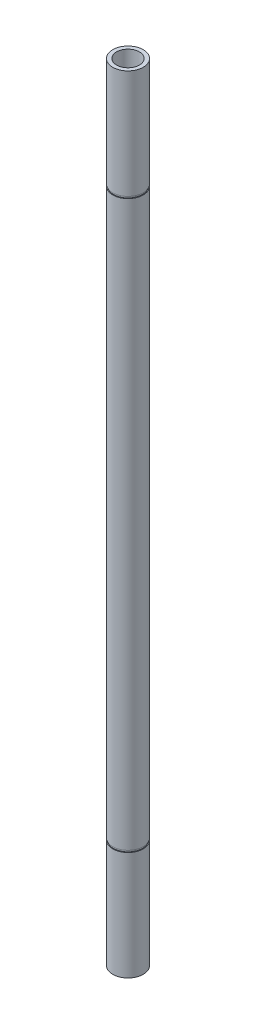
ISO-10303-21;
HEADER;
FILE_DESCRIPTION(('STEP AP214'),'2;1');
FILE_NAME('part.step','',(''),(''),'','','');
FILE_SCHEMA(('AUTOMOTIVE_DESIGN { 1 0 10303 214 1 1 1 1 }'));
ENDSEC;
DATA;
#1=APPLICATION_CONTEXT('core data for automotive mechanical design processes');
#2=APPLICATION_PROTOCOL_DEFINITION('international standard','automotive_design',2000,#1);
#3=PRODUCT_CONTEXT('',#1,'mechanical');
#4=PRODUCT('Part','Part','',(#3));
#5=PRODUCT_RELATED_PRODUCT_CATEGORY('part','',(#4));
#6=PRODUCT_DEFINITION_FORMATION('','',#4);
#7=PRODUCT_DEFINITION_CONTEXT('part definition',#1,'design');
#8=PRODUCT_DEFINITION('design','',#6,#7);
#9=PRODUCT_DEFINITION_SHAPE('','',#8);
#10=(LENGTH_UNIT() NAMED_UNIT(*) SI_UNIT(.MILLI.,.METRE.));
#11=(NAMED_UNIT(*) PLANE_ANGLE_UNIT() SI_UNIT($,.RADIAN.));
#12=(NAMED_UNIT(*) SI_UNIT($,.STERADIAN.) SOLID_ANGLE_UNIT());
#13=UNCERTAINTY_MEASURE_WITH_UNIT(LENGTH_MEASURE(1.E-05),#10,'distance_accuracy_value','');
#14=(GEOMETRIC_REPRESENTATION_CONTEXT(3) GLOBAL_UNCERTAINTY_ASSIGNED_CONTEXT((#13)) GLOBAL_UNIT_ASSIGNED_CONTEXT((#10,
#11,#12)) REPRESENTATION_CONTEXT('',''));
#15=CARTESIAN_POINT('',(0.,0.,0.));
#16=DIRECTION('',(0.,0.,1.));
#17=DIRECTION('',(1.,0.,0.));
#18=AXIS2_PLACEMENT_3D('',#15,#16,#17);
#19=CARTESIAN_POINT('',(0.,64.3022671838045,0.));
#20=DIRECTION('',(0.,1.,0.));
#21=DIRECTION('',(0.,0.,1.));
#22=AXIS2_PLACEMENT_3D('',#19,#20,#21);
#23=CYLINDRICAL_SURFACE('',#22,3.00000000000001);
#24=CARTESIAN_POINT('',(0.,103.,0.));
#25=DIRECTION('',(0.,1.,0.));
#26=DIRECTION('',(0.,0.,1.));
#27=AXIS2_PLACEMENT_3D('',#24,#25,#26);
#28=CIRCLE('',#27,3.00000000000001);
#29=CARTESIAN_POINT('',(0.,103.,3.00000000000001));
#30=VERTEX_POINT('',#29);
#31=EDGE_CURVE('E94',#30,#30,#28,.T.);
#32=ORIENTED_EDGE('',*,*,#31,.T.);
#33=EDGE_LOOP('',(#32));
#34=FACE_BOUND('',#33,.T.);
#35=CARTESIAN_POINT('',(0.,-103.,0.));
#36=DIRECTION('',(0.,1.,0.));
#37=DIRECTION('',(0.,0.,1.));
#38=AXIS2_PLACEMENT_3D('',#35,#36,#37);
#39=CIRCLE('',#38,3.00000000000001);
#40=CARTESIAN_POINT('',(0.,-103.,3.00000000000001));
#41=VERTEX_POINT('',#40);
#42=EDGE_CURVE('E10',#41,#41,#39,.T.);
#43=ORIENTED_EDGE('',*,*,#42,.F.);
#44=EDGE_LOOP('',(#43));
#45=FACE_BOUND('',#44,.T.);
#46=ADVANCED_FACE('F43',(#34,#45),#23,.F.);
#47=CARTESIAN_POINT('',(-3.00000000000001,-103.,0.));
#48=DIRECTION('',(0.,-1.,0.));
#49=DIRECTION('',(0.,0.,-1.));
#50=AXIS2_PLACEMENT_3D('',#47,#48,#49);
#51=PLANE('',#50);
#52=ORIENTED_EDGE('',*,*,#42,.T.);
#53=EDGE_LOOP('',(#52));
#54=FACE_BOUND('',#53,.T.);
#55=CARTESIAN_POINT('',(0.,-103.,0.));
#56=DIRECTION('',(0.,1.,0.));
#57=DIRECTION('',(0.,0.,1.));
#58=AXIS2_PLACEMENT_3D('',#55,#56,#57);
#59=CIRCLE('',#58,4.00000000000001);
#60=CARTESIAN_POINT('',(0.,-103.,4.00000000000001));
#61=VERTEX_POINT('',#60);
#62=EDGE_CURVE('E49',#61,#61,#59,.T.);
#63=ORIENTED_EDGE('',*,*,#62,.F.);
#64=EDGE_LOOP('',(#63));
#65=FACE_BOUND('',#64,.T.);
#66=ADVANCED_FACE('F114',(#54,#65),#51,.T.);
#67=CARTESIAN_POINT('',(0.,64.3022671838045,0.));
#68=DIRECTION('',(0.,1.,0.));
#69=DIRECTION('',(0.,0.,1.));
#70=AXIS2_PLACEMENT_3D('',#67,#68,#69);
#71=CYLINDRICAL_SURFACE('',#70,4.00000000000001);
#72=ORIENTED_EDGE('',*,*,#62,.T.);
#73=EDGE_LOOP('',(#72));
#74=FACE_BOUND('',#73,.T.);
#75=CARTESIAN_POINT('',(0.,-74.5,0.));
#76=DIRECTION('',(0.,1.,0.));
#77=DIRECTION('',(0.,0.,1.));
#78=AXIS2_PLACEMENT_3D('',#75,#76,#77);
#79=CIRCLE('',#78,4.);
#80=CARTESIAN_POINT('',(0.,-74.5,4.));
#81=VERTEX_POINT('',#80);
#82=EDGE_CURVE('E54',#81,#81,#79,.T.);
#83=ORIENTED_EDGE('',*,*,#82,.F.);
#84=EDGE_LOOP('',(#83));
#85=FACE_BOUND('',#84,.T.);
#86=ADVANCED_FACE('F120',(#74,#85),#71,.T.);
#87=CARTESIAN_POINT('',(-4.,-74.5,0.));
#88=DIRECTION('',(0.,1.,0.));
#89=DIRECTION('',(0.,0.,1.));
#90=AXIS2_PLACEMENT_3D('',#87,#88,#89);
#91=PLANE('',#90);
#92=ORIENTED_EDGE('',*,*,#82,.T.);
#93=EDGE_LOOP('',(#92));
#94=FACE_BOUND('',#93,.T.);
#95=CARTESIAN_POINT('',(0.,-74.5,0.));
#96=DIRECTION('',(0.,1.,0.));
#97=DIRECTION('',(0.,0.,1.));
#98=AXIS2_PLACEMENT_3D('',#95,#96,#97);
#99=CIRCLE('',#98,3.8);
#100=CARTESIAN_POINT('',(0.,-74.5,3.8));
#101=VERTEX_POINT('',#100);
#102=EDGE_CURVE('E58',#101,#101,#99,.T.);
#103=ORIENTED_EDGE('',*,*,#102,.F.);
#104=EDGE_LOOP('',(#103));
#105=FACE_BOUND('',#104,.T.);
#106=ADVANCED_FACE('F124',(#94,#105),#91,.T.);
#107=CARTESIAN_POINT('',(0.,64.3022671838045,0.));
#108=DIRECTION('',(0.,1.,0.));
#109=DIRECTION('',(0.,0.,1.));
#110=AXIS2_PLACEMENT_3D('',#107,#108,#109);
#111=CYLINDRICAL_SURFACE('',#110,3.8);
#112=ORIENTED_EDGE('',*,*,#102,.T.);
#113=EDGE_LOOP('',(#112));
#114=FACE_BOUND('',#113,.T.);
#115=CARTESIAN_POINT('',(0.,-74.,0.));
#116=DIRECTION('',(0.,1.,0.));
#117=DIRECTION('',(0.,0.,1.));
#118=AXIS2_PLACEMENT_3D('',#115,#116,#117);
#119=CIRCLE('',#118,3.8);
#120=CARTESIAN_POINT('',(0.,-74.,3.8));
#121=VERTEX_POINT('',#120);
#122=EDGE_CURVE('E69',#121,#121,#119,.T.);
#123=ORIENTED_EDGE('',*,*,#122,.F.);
#124=EDGE_LOOP('',(#123));
#125=FACE_BOUND('',#124,.T.);
#126=ADVANCED_FACE('F130',(#114,#125),#111,.T.);
#127=CARTESIAN_POINT('',(-3.8,-74.,0.));
#128=DIRECTION('',(0.,-1.,0.));
#129=DIRECTION('',(0.,0.,-1.));
#130=AXIS2_PLACEMENT_3D('',#127,#128,#129);
#131=PLANE('',#130);
#132=ORIENTED_EDGE('',*,*,#122,.T.);
#133=EDGE_LOOP('',(#132));
#134=FACE_BOUND('',#133,.T.);
#135=CARTESIAN_POINT('',(0.,-74.,0.));
#136=DIRECTION('',(0.,1.,0.));
#137=DIRECTION('',(0.,0.,1.));
#138=AXIS2_PLACEMENT_3D('',#135,#136,#137);
#139=CIRCLE('',#138,3.99999999999998);
#140=CARTESIAN_POINT('',(0.,-74.,3.99999999999998));
#141=VERTEX_POINT('',#140);
#142=EDGE_CURVE('E67',#141,#141,#139,.T.);
#143=ORIENTED_EDGE('',*,*,#142,.F.);
#144=EDGE_LOOP('',(#143));
#145=FACE_BOUND('',#144,.T.);
#146=ADVANCED_FACE('F131',(#134,#145),#131,.T.);
#147=CARTESIAN_POINT('',(0.,64.3022671838045,0.));
#148=DIRECTION('',(0.,1.,0.));
#149=DIRECTION('',(0.,0.,1.));
#150=AXIS2_PLACEMENT_3D('',#147,#148,#149);
#151=CYLINDRICAL_SURFACE('',#150,3.99999999999998);
#152=ORIENTED_EDGE('',*,*,#142,.T.);
#153=EDGE_LOOP('',(#152));
#154=FACE_BOUND('',#153,.T.);
#155=CARTESIAN_POINT('',(0.,74.,0.));
#156=DIRECTION('',(0.,1.,0.));
#157=DIRECTION('',(0.,0.,1.));
#158=AXIS2_PLACEMENT_3D('',#155,#156,#157);
#159=CIRCLE('',#158,3.99999999999998);
#160=CARTESIAN_POINT('',(0.,74.,3.99999999999998));
#161=VERTEX_POINT('',#160);
#162=EDGE_CURVE('E74',#161,#161,#159,.T.);
#163=ORIENTED_EDGE('',*,*,#162,.F.);
#164=EDGE_LOOP('',(#163));
#165=FACE_BOUND('',#164,.T.);
#166=ADVANCED_FACE('F134',(#154,#165),#151,.T.);
#167=CARTESIAN_POINT('',(-3.8,74.,0.));
#168=DIRECTION('',(0.,1.,0.));
#169=DIRECTION('',(0.,0.,1.));
#170=AXIS2_PLACEMENT_3D('',#167,#168,#169);
#171=PLANE('',#170);
#172=ORIENTED_EDGE('',*,*,#162,.T.);
#173=EDGE_LOOP('',(#172));
#174=FACE_BOUND('',#173,.T.);
#175=CARTESIAN_POINT('',(0.,74.,0.));
#176=DIRECTION('',(0.,1.,0.));
#177=DIRECTION('',(0.,0.,1.));
#178=AXIS2_PLACEMENT_3D('',#175,#176,#177);
#179=CIRCLE('',#178,3.8);
#180=CARTESIAN_POINT('',(0.,74.,3.8));
#181=VERTEX_POINT('',#180);
#182=EDGE_CURVE('E77',#181,#181,#179,.T.);
#183=ORIENTED_EDGE('',*,*,#182,.F.);
#184=EDGE_LOOP('',(#183));
#185=FACE_BOUND('',#184,.T.);
#186=ADVANCED_FACE('F138',(#174,#185),#171,.T.);
#187=CARTESIAN_POINT('',(0.,64.3022671838045,0.));
#188=DIRECTION('',(0.,1.,0.));
#189=DIRECTION('',(0.,0.,1.));
#190=AXIS2_PLACEMENT_3D('',#187,#188,#189);
#191=CYLINDRICAL_SURFACE('',#190,3.8);
#192=ORIENTED_EDGE('',*,*,#182,.T.);
#193=EDGE_LOOP('',(#192));
#194=FACE_BOUND('',#193,.T.);
#195=CARTESIAN_POINT('',(0.,74.5,0.));
#196=DIRECTION('',(0.,1.,0.));
#197=DIRECTION('',(0.,0.,1.));
#198=AXIS2_PLACEMENT_3D('',#195,#196,#197);
#199=CIRCLE('',#198,3.8);
#200=CARTESIAN_POINT('',(0.,74.5,3.8));
#201=VERTEX_POINT('',#200);
#202=EDGE_CURVE('E81',#201,#201,#199,.T.);
#203=ORIENTED_EDGE('',*,*,#202,.F.);
#204=EDGE_LOOP('',(#203));
#205=FACE_BOUND('',#204,.T.);
#206=ADVANCED_FACE('F141',(#194,#205),#191,.T.);
#207=CARTESIAN_POINT('',(-4.,74.5,0.));
#208=DIRECTION('',(0.,-1.,0.));
#209=DIRECTION('',(0.,0.,-1.));
#210=AXIS2_PLACEMENT_3D('',#207,#208,#209);
#211=PLANE('',#210);
#212=ORIENTED_EDGE('',*,*,#202,.T.);
#213=EDGE_LOOP('',(#212));
#214=FACE_BOUND('',#213,.T.);
#215=CARTESIAN_POINT('',(0.,74.5,0.));
#216=DIRECTION('',(0.,1.,0.));
#217=DIRECTION('',(0.,0.,1.));
#218=AXIS2_PLACEMENT_3D('',#215,#216,#217);
#219=CIRCLE('',#218,4.);
#220=CARTESIAN_POINT('',(0.,74.5,4.));
#221=VERTEX_POINT('',#220);
#222=EDGE_CURVE('E88',#221,#221,#219,.T.);
#223=ORIENTED_EDGE('',*,*,#222,.F.);
#224=EDGE_LOOP('',(#223));
#225=FACE_BOUND('',#224,.T.);
#226=ADVANCED_FACE('F108',(#214,#225),#211,.T.);
#227=CARTESIAN_POINT('',(0.,64.3022671838045,0.));
#228=DIRECTION('',(0.,1.,0.));
#229=DIRECTION('',(0.,0.,1.));
#230=AXIS2_PLACEMENT_3D('',#227,#228,#229);
#231=CYLINDRICAL_SURFACE('',#230,4.00000000000001);
#232=ORIENTED_EDGE('',*,*,#222,.T.);
#233=EDGE_LOOP('',(#232));
#234=FACE_BOUND('',#233,.T.);
#235=CARTESIAN_POINT('',(0.,103.,0.));
#236=DIRECTION('',(0.,1.,0.));
#237=DIRECTION('',(0.,0.,1.));
#238=AXIS2_PLACEMENT_3D('',#235,#236,#237);
#239=CIRCLE('',#238,4.00000000000001);
#240=CARTESIAN_POINT('',(0.,103.,4.00000000000001));
#241=VERTEX_POINT('',#240);
#242=EDGE_CURVE('E89',#241,#241,#239,.T.);
#243=ORIENTED_EDGE('',*,*,#242,.F.);
#244=EDGE_LOOP('',(#243));
#245=FACE_BOUND('',#244,.T.);
#246=ADVANCED_FACE('F103',(#234,#245),#231,.T.);
#247=CARTESIAN_POINT('',(-3.00000000000001,103.,0.));
#248=DIRECTION('',(0.,1.,0.));
#249=DIRECTION('',(0.,0.,1.));
#250=AXIS2_PLACEMENT_3D('',#247,#248,#249);
#251=PLANE('',#250);
#252=ORIENTED_EDGE('',*,*,#242,.T.);
#253=EDGE_LOOP('',(#252));
#254=FACE_BOUND('',#253,.T.);
#255=ORIENTED_EDGE('',*,*,#31,.F.);
#256=EDGE_LOOP('',(#255));
#257=FACE_BOUND('',#256,.T.);
#258=ADVANCED_FACE('F101',(#254,#257),#251,.T.);
#259=CLOSED_SHELL('',(#46,#66,#86,#106,#126,#146,#166,#186,#206,#226,#246,#258));
#260=MANIFOLD_SOLID_BREP('B2',#259);
#261=ADVANCED_BREP_SHAPE_REPRESENTATION('',(#18,#260),#14);
#262=SHAPE_DEFINITION_REPRESENTATION(#9,#261);
ENDSEC;
END-ISO-10303-21;
